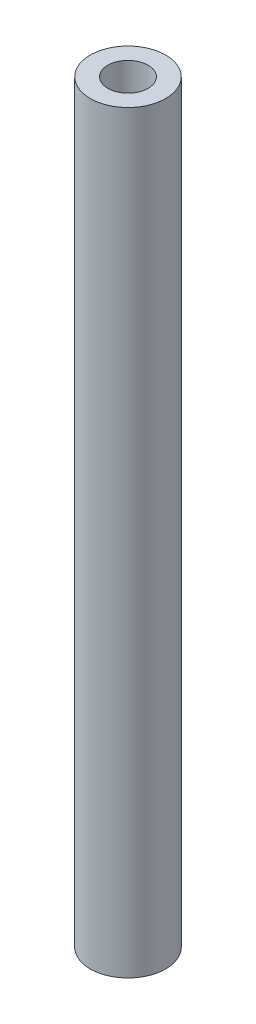
ISO-10303-21;
HEADER;
FILE_DESCRIPTION(('STEP AP214'),'2;1');
FILE_NAME('part.step','',(''),(''),'','','');
FILE_SCHEMA(('AUTOMOTIVE_DESIGN { 1 0 10303 214 1 1 1 1 }'));
ENDSEC;
DATA;
#1=APPLICATION_CONTEXT('core data for automotive mechanical design processes');
#2=APPLICATION_PROTOCOL_DEFINITION('international standard','automotive_design',2000,#1);
#3=PRODUCT_CONTEXT('',#1,'mechanical');
#4=PRODUCT('Part','Part','',(#3));
#5=PRODUCT_RELATED_PRODUCT_CATEGORY('part','',(#4));
#6=PRODUCT_DEFINITION_FORMATION('','',#4);
#7=PRODUCT_DEFINITION_CONTEXT('part definition',#1,'design');
#8=PRODUCT_DEFINITION('design','',#6,#7);
#9=PRODUCT_DEFINITION_SHAPE('','',#8);
#10=(LENGTH_UNIT() NAMED_UNIT(*) SI_UNIT(.MILLI.,.METRE.));
#11=(NAMED_UNIT(*) PLANE_ANGLE_UNIT() SI_UNIT($,.RADIAN.));
#12=(NAMED_UNIT(*) SI_UNIT($,.STERADIAN.) SOLID_ANGLE_UNIT());
#13=UNCERTAINTY_MEASURE_WITH_UNIT(LENGTH_MEASURE(1.E-05),#10,'distance_accuracy_value','');
#14=(GEOMETRIC_REPRESENTATION_CONTEXT(3) GLOBAL_UNCERTAINTY_ASSIGNED_CONTEXT((#13)) GLOBAL_UNIT_ASSIGNED_CONTEXT((#10,
#11,#12)) REPRESENTATION_CONTEXT('',''));
#15=CARTESIAN_POINT('',(0.,0.,0.));
#16=DIRECTION('',(0.,0.,1.));
#17=DIRECTION('',(1.,0.,0.));
#18=AXIS2_PLACEMENT_3D('',#15,#16,#17);
#19=CARTESIAN_POINT('',(0.,127.,0.));
#20=DIRECTION('',(0.,-1.,0.));
#21=DIRECTION('',(0.,0.,-1.));
#22=AXIS2_PLACEMENT_3D('',#19,#20,#21);
#23=CYLINDRICAL_SURFACE('',#22,6.35);
#24=CARTESIAN_POINT('',(0.,127.,0.));
#25=DIRECTION('',(0.,1.,0.));
#26=DIRECTION('',(0.,0.,1.));
#27=AXIS2_PLACEMENT_3D('',#24,#25,#26);
#28=CIRCLE('',#27,6.35);
#29=CARTESIAN_POINT('',(0.,127.,6.35));
#30=VERTEX_POINT('',#29);
#31=EDGE_CURVE('E10',#30,#30,#28,.T.);
#32=ORIENTED_EDGE('',*,*,#31,.F.);
#33=EDGE_LOOP('',(#32));
#34=FACE_BOUND('',#33,.T.);
#35=CARTESIAN_POINT('',(0.,0.,0.));
#36=DIRECTION('',(0.,1.,0.));
#37=DIRECTION('',(0.,0.,1.));
#38=AXIS2_PLACEMENT_3D('',#35,#36,#37);
#39=CIRCLE('',#38,6.35);
#40=CARTESIAN_POINT('',(0.,0.,6.35));
#41=VERTEX_POINT('',#40);
#42=EDGE_CURVE('E38',#41,#41,#39,.T.);
#43=ORIENTED_EDGE('',*,*,#42,.T.);
#44=EDGE_LOOP('',(#43));
#45=FACE_BOUND('',#44,.T.);
#46=ADVANCED_FACE('F31',(#34,#45),#23,.T.);
#47=CARTESIAN_POINT('',(0.,127.,0.));
#48=DIRECTION('',(0.,1.,0.));
#49=DIRECTION('',(0.,0.,1.));
#50=AXIS2_PLACEMENT_3D('',#47,#48,#49);
#51=PLANE('',#50);
#52=CARTESIAN_POINT('',(0.,127.,0.));
#53=DIRECTION('',(0.,1.,0.));
#54=DIRECTION('',(0.,0.,1.));
#55=AXIS2_PLACEMENT_3D('',#52,#53,#54);
#56=CIRCLE('',#55,3.38948585008411);
#57=CARTESIAN_POINT('',(0.,127.,3.38948585008411));
#58=VERTEX_POINT('',#57);
#59=EDGE_CURVE('E44',#58,#58,#56,.T.);
#60=ORIENTED_EDGE('',*,*,#59,.F.);
#61=EDGE_LOOP('',(#60));
#62=FACE_BOUND('',#61,.T.);
#63=ORIENTED_EDGE('',*,*,#31,.T.);
#64=EDGE_LOOP('',(#63));
#65=FACE_BOUND('',#64,.T.);
#66=ADVANCED_FACE('F61',(#62,#65),#51,.T.);
#67=CARTESIAN_POINT('',(0.,0.,0.));
#68=DIRECTION('',(0.,1.,0.));
#69=DIRECTION('',(0.,0.,1.));
#70=AXIS2_PLACEMENT_3D('',#67,#68,#69);
#71=PLANE('',#70);
#72=CARTESIAN_POINT('',(0.,0.,0.));
#73=DIRECTION('',(0.,1.,0.));
#74=DIRECTION('',(0.,0.,1.));
#75=AXIS2_PLACEMENT_3D('',#72,#73,#74);
#76=CIRCLE('',#75,3.38948585008411);
#77=CARTESIAN_POINT('',(0.,0.,3.38948585008411));
#78=VERTEX_POINT('',#77);
#79=EDGE_CURVE('E34',#78,#78,#76,.T.);
#80=ORIENTED_EDGE('',*,*,#79,.T.);
#81=EDGE_LOOP('',(#80));
#82=FACE_BOUND('',#81,.T.);
#83=ORIENTED_EDGE('',*,*,#42,.F.);
#84=EDGE_LOOP('',(#83));
#85=FACE_BOUND('',#84,.T.);
#86=ADVANCED_FACE('F51',(#82,#85),#71,.F.);
#87=CARTESIAN_POINT('',(0.,-7.61999999999971,0.));
#88=DIRECTION('',(0.,1.,0.));
#89=DIRECTION('',(0.,0.,1.));
#90=AXIS2_PLACEMENT_3D('',#87,#88,#89);
#91=CYLINDRICAL_SURFACE('',#90,3.38948585008411);
#92=ORIENTED_EDGE('',*,*,#59,.T.);
#93=EDGE_LOOP('',(#92));
#94=FACE_BOUND('',#93,.T.);
#95=ORIENTED_EDGE('',*,*,#79,.F.);
#96=EDGE_LOOP('',(#95));
#97=FACE_BOUND('',#96,.T.);
#98=ADVANCED_FACE('F54',(#94,#97),#91,.F.);
#99=CLOSED_SHELL('',(#46,#66,#86,#98));
#100=MANIFOLD_SOLID_BREP('B2',#99);
#101=ADVANCED_BREP_SHAPE_REPRESENTATION('',(#18,#100),#14);
#102=SHAPE_DEFINITION_REPRESENTATION(#9,#101);
ENDSEC;
END-ISO-10303-21;
